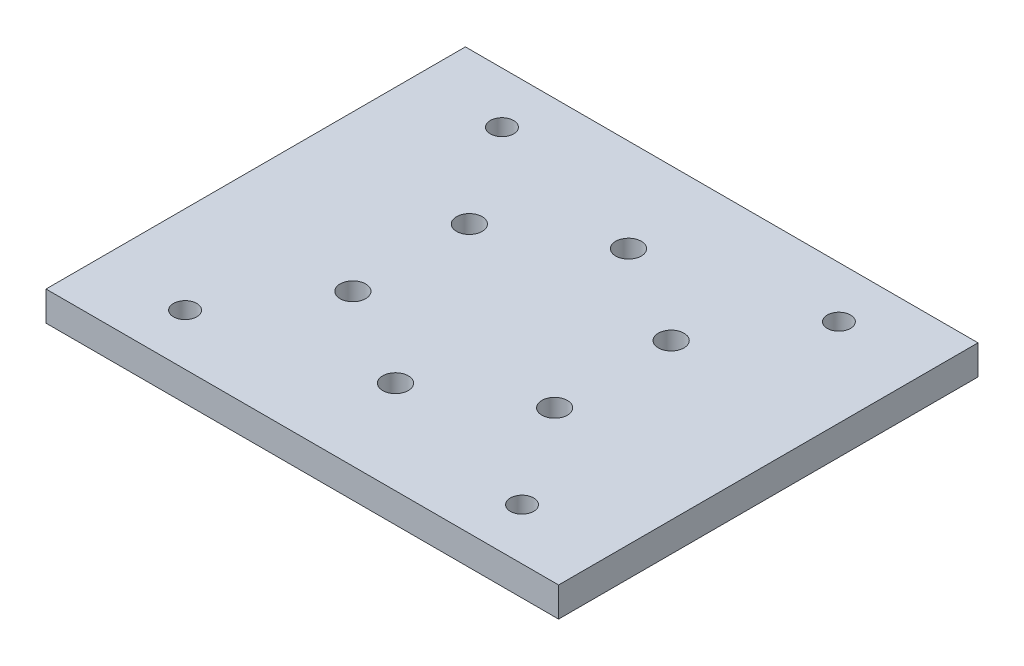
ISO-10303-21;
HEADER;
FILE_DESCRIPTION(('STEP AP214'),'2;1');
FILE_NAME('part.step','',(''),(''),'','','');
FILE_SCHEMA(('AUTOMOTIVE_DESIGN { 1 0 10303 214 1 1 1 1 }'));
ENDSEC;
DATA;
#1=APPLICATION_CONTEXT('core data for automotive mechanical design processes');
#2=APPLICATION_PROTOCOL_DEFINITION('international standard','automotive_design',2000,#1);
#3=PRODUCT_CONTEXT('',#1,'mechanical');
#4=PRODUCT('Part','Part','',(#3));
#5=PRODUCT_RELATED_PRODUCT_CATEGORY('part','',(#4));
#6=PRODUCT_DEFINITION_FORMATION('','',#4);
#7=PRODUCT_DEFINITION_CONTEXT('part definition',#1,'design');
#8=PRODUCT_DEFINITION('design','',#6,#7);
#9=PRODUCT_DEFINITION_SHAPE('','',#8);
#10=(LENGTH_UNIT() NAMED_UNIT(*) SI_UNIT(.MILLI.,.METRE.));
#11=(NAMED_UNIT(*) PLANE_ANGLE_UNIT() SI_UNIT($,.RADIAN.));
#12=(NAMED_UNIT(*) SI_UNIT($,.STERADIAN.) SOLID_ANGLE_UNIT());
#13=UNCERTAINTY_MEASURE_WITH_UNIT(LENGTH_MEASURE(1.E-05),#10,'distance_accuracy_value','');
#14=(GEOMETRIC_REPRESENTATION_CONTEXT(3) GLOBAL_UNCERTAINTY_ASSIGNED_CONTEXT((#13)) GLOBAL_UNIT_ASSIGNED_CONTEXT((#10,
#11,#12)) REPRESENTATION_CONTEXT('',''));
#15=CARTESIAN_POINT('',(0.,0.,0.));
#16=DIRECTION('',(0.,0.,1.));
#17=DIRECTION('',(1.,0.,0.));
#18=AXIS2_PLACEMENT_3D('',#15,#16,#17);
#19=CARTESIAN_POINT('',(110.,6.35,0.));
#20=DIRECTION('',(0.,0.,-1.));
#21=DIRECTION('',(-1.,0.,0.));
#22=AXIS2_PLACEMENT_3D('',#19,#20,#21);
#23=PLANE('',#22);
#24=DIRECTION('',(1.,0.,0.));
#25=VECTOR('',#24,1.);
#26=CARTESIAN_POINT('',(110.,0.,0.));
#27=LINE('',#26,#25);
#28=CARTESIAN_POINT('',(0.,0.,0.));
#29=VERTEX_POINT('',#28);
#30=CARTESIAN_POINT('',(110.,0.,0.));
#31=VERTEX_POINT('',#30);
#32=EDGE_CURVE('E102',#29,#31,#27,.T.);
#33=ORIENTED_EDGE('',*,*,#32,.T.);
#34=DIRECTION('',(0.,-1.,0.));
#35=VECTOR('',#34,1.);
#36=CARTESIAN_POINT('',(110.,6.35,0.));
#37=LINE('',#36,#35);
#38=CARTESIAN_POINT('',(110.,6.35,0.));
#39=VERTEX_POINT('',#38);
#40=EDGE_CURVE('E11',#39,#31,#37,.T.);
#41=ORIENTED_EDGE('',*,*,#40,.F.);
#42=DIRECTION('',(1.,0.,0.));
#43=VECTOR('',#42,1.);
#44=CARTESIAN_POINT('',(110.,6.35,0.));
#45=LINE('',#44,#43);
#46=CARTESIAN_POINT('',(0.,6.35,0.));
#47=VERTEX_POINT('',#46);
#48=EDGE_CURVE('E90',#47,#39,#45,.T.);
#49=ORIENTED_EDGE('',*,*,#48,.F.);
#50=DIRECTION('',(0.,-1.,0.));
#51=VECTOR('',#50,1.);
#52=CARTESIAN_POINT('',(0.,6.35,0.));
#53=LINE('',#52,#51);
#54=EDGE_CURVE('E98',#47,#29,#53,.T.);
#55=ORIENTED_EDGE('',*,*,#54,.T.);
#56=EDGE_LOOP('',(#33,#41,#49,#55));
#57=FACE_BOUND('',#56,.T.);
#58=ADVANCED_FACE('F39',(#57),#23,.F.);
#59=CARTESIAN_POINT('',(110.,6.35,-90.));
#60=DIRECTION('',(-1.,0.,0.));
#61=DIRECTION('',(0.,0.,1.));
#62=AXIS2_PLACEMENT_3D('',#59,#60,#61);
#63=PLANE('',#62);
#64=DIRECTION('',(0.,0.,-1.));
#65=VECTOR('',#64,1.);
#66=CARTESIAN_POINT('',(110.,0.,-90.));
#67=LINE('',#66,#65);
#68=CARTESIAN_POINT('',(110.,0.,-90.));
#69=VERTEX_POINT('',#68);
#70=EDGE_CURVE('E94',#31,#69,#67,.T.);
#71=ORIENTED_EDGE('',*,*,#70,.T.);
#72=DIRECTION('',(0.,-1.,0.));
#73=VECTOR('',#72,1.);
#74=CARTESIAN_POINT('',(110.,6.35,-90.));
#75=LINE('',#74,#73);
#76=CARTESIAN_POINT('',(110.,6.35,-90.));
#77=VERTEX_POINT('',#76);
#78=EDGE_CURVE('E47',#77,#69,#75,.T.);
#79=ORIENTED_EDGE('',*,*,#78,.F.);
#80=DIRECTION('',(0.,0.,-1.));
#81=VECTOR('',#80,1.);
#82=CARTESIAN_POINT('',(110.,6.35,-90.));
#83=LINE('',#82,#81);
#84=EDGE_CURVE('E85',#39,#77,#83,.T.);
#85=ORIENTED_EDGE('',*,*,#84,.F.);
#86=ORIENTED_EDGE('',*,*,#40,.T.);
#87=EDGE_LOOP('',(#71,#79,#85,#86));
#88=FACE_BOUND('',#87,.T.);
#89=ADVANCED_FACE('F93',(#88),#63,.F.);
#90=CARTESIAN_POINT('',(0.,6.35,-90.));
#91=DIRECTION('',(0.,0.,1.));
#92=DIRECTION('',(1.,0.,0.));
#93=AXIS2_PLACEMENT_3D('',#90,#91,#92);
#94=PLANE('',#93);
#95=DIRECTION('',(-1.,0.,0.));
#96=VECTOR('',#95,1.);
#97=CARTESIAN_POINT('',(0.,0.,-90.));
#98=LINE('',#97,#96);
#99=CARTESIAN_POINT('',(0.,0.,-90.));
#100=VERTEX_POINT('',#99);
#101=EDGE_CURVE('E72',#69,#100,#98,.T.);
#102=ORIENTED_EDGE('',*,*,#101,.T.);
#103=DIRECTION('',(0.,-1.,0.));
#104=VECTOR('',#103,1.);
#105=CARTESIAN_POINT('',(0.,6.35,-90.));
#106=LINE('',#105,#104);
#107=CARTESIAN_POINT('',(0.,6.35,-90.));
#108=VERTEX_POINT('',#107);
#109=EDGE_CURVE('E95',#108,#100,#106,.T.);
#110=ORIENTED_EDGE('',*,*,#109,.F.);
#111=DIRECTION('',(-1.,0.,0.));
#112=VECTOR('',#111,1.);
#113=CARTESIAN_POINT('',(0.,6.35,-90.));
#114=LINE('',#113,#112);
#115=EDGE_CURVE('E88',#77,#108,#114,.T.);
#116=ORIENTED_EDGE('',*,*,#115,.F.);
#117=ORIENTED_EDGE('',*,*,#78,.T.);
#118=EDGE_LOOP('',(#102,#110,#116,#117));
#119=FACE_BOUND('',#118,.T.);
#120=ADVANCED_FACE('F96',(#119),#94,.F.);
#121=CARTESIAN_POINT('',(0.,6.35,0.));
#122=DIRECTION('',(1.,0.,0.));
#123=DIRECTION('',(0.,0.,-1.));
#124=AXIS2_PLACEMENT_3D('',#121,#122,#123);
#125=PLANE('',#124);
#126=DIRECTION('',(0.,0.,1.));
#127=VECTOR('',#126,1.);
#128=CARTESIAN_POINT('',(0.,0.,0.));
#129=LINE('',#128,#127);
#130=EDGE_CURVE('E78',#100,#29,#129,.T.);
#131=ORIENTED_EDGE('',*,*,#130,.T.);
#132=ORIENTED_EDGE('',*,*,#54,.F.);
#133=DIRECTION('',(0.,0.,1.));
#134=VECTOR('',#133,1.);
#135=CARTESIAN_POINT('',(0.,6.35,0.));
#136=LINE('',#135,#134);
#137=EDGE_CURVE('E55',#108,#47,#136,.T.);
#138=ORIENTED_EDGE('',*,*,#137,.F.);
#139=ORIENTED_EDGE('',*,*,#109,.T.);
#140=EDGE_LOOP('',(#131,#132,#138,#139));
#141=FACE_BOUND('',#140,.T.);
#142=ADVANCED_FACE('F110',(#141),#125,.F.);
#143=CARTESIAN_POINT('',(0.,6.35,0.));
#144=DIRECTION('',(0.,-1.,0.));
#145=DIRECTION('',(0.,0.,-1.));
#146=AXIS2_PLACEMENT_3D('',#143,#144,#145);
#147=PLANE('',#146);
#148=CARTESIAN_POINT('',(55.,6.35,-70.));
#149=DIRECTION('',(0.,1.,0.));
#150=DIRECTION('',(0.,0.,1.));
#151=AXIS2_PLACEMENT_3D('',#148,#149,#150);
#152=CIRCLE('',#151,2.75);
#153=CARTESIAN_POINT('',(55.,6.35,-67.25));
#154=VERTEX_POINT('',#153);
#155=EDGE_CURVE('E165',#154,#154,#152,.T.);
#156=ORIENTED_EDGE('',*,*,#155,.F.);
#157=EDGE_LOOP('',(#156));
#158=FACE_BOUND('',#157,.T.);
#159=CARTESIAN_POINT('',(33.3493649053895,6.35,-57.4999999999997));
#160=DIRECTION('',(0.,1.,0.));
#161=DIRECTION('',(0.,0.,1.));
#162=AXIS2_PLACEMENT_3D('',#159,#160,#161);
#163=CIRCLE('',#162,2.75);
#164=CARTESIAN_POINT('',(33.3493649053895,6.35,-54.7499999999997));
#165=VERTEX_POINT('',#164);
#166=EDGE_CURVE('E144',#165,#165,#163,.T.);
#167=ORIENTED_EDGE('',*,*,#166,.F.);
#168=EDGE_LOOP('',(#167));
#169=FACE_BOUND('',#168,.T.);
#170=CARTESIAN_POINT('',(33.349364905389,6.35,-32.5));
#171=DIRECTION('',(0.,1.,0.));
#172=DIRECTION('',(0.,0.,1.));
#173=AXIS2_PLACEMENT_3D('',#170,#171,#172);
#174=CIRCLE('',#173,2.75);
#175=CARTESIAN_POINT('',(33.349364905389,6.35,-29.75));
#176=VERTEX_POINT('',#175);
#177=EDGE_CURVE('E143',#176,#176,#174,.T.);
#178=ORIENTED_EDGE('',*,*,#177,.F.);
#179=EDGE_LOOP('',(#178));
#180=FACE_BOUND('',#179,.T.);
#181=CARTESIAN_POINT('',(55.,6.35,-19.9999999999999));
#182=DIRECTION('',(0.,1.,0.));
#183=DIRECTION('',(0.,0.,1.));
#184=AXIS2_PLACEMENT_3D('',#181,#182,#183);
#185=CIRCLE('',#184,2.75);
#186=CARTESIAN_POINT('',(55.,6.35,-17.2499999999999));
#187=VERTEX_POINT('',#186);
#188=EDGE_CURVE('E150',#187,#187,#185,.T.);
#189=ORIENTED_EDGE('',*,*,#188,.F.);
#190=EDGE_LOOP('',(#189));
#191=FACE_BOUND('',#190,.T.);
#192=CARTESIAN_POINT('',(76.650635094611,6.35,-32.4999999999999));
#193=DIRECTION('',(0.,1.,0.));
#194=DIRECTION('',(0.,0.,1.));
#195=AXIS2_PLACEMENT_3D('',#192,#193,#194);
#196=CIRCLE('',#195,2.75000000000001);
#197=CARTESIAN_POINT('',(76.650635094611,6.35,-29.7499999999999));
#198=VERTEX_POINT('',#197);
#199=EDGE_CURVE('E156',#198,#198,#196,.T.);
#200=ORIENTED_EDGE('',*,*,#199,.F.);
#201=EDGE_LOOP('',(#200));
#202=FACE_BOUND('',#201,.T.);
#203=CARTESIAN_POINT('',(76.6506350946114,6.35,-57.5000000000006));
#204=DIRECTION('',(0.,1.,0.));
#205=DIRECTION('',(0.,0.,1.));
#206=AXIS2_PLACEMENT_3D('',#203,#204,#205);
#207=CIRCLE('',#206,2.75000000000001);
#208=CARTESIAN_POINT('',(76.6506350946114,6.35,-54.7500000000006));
#209=VERTEX_POINT('',#208);
#210=EDGE_CURVE('E162',#209,#209,#207,.T.);
#211=ORIENTED_EDGE('',*,*,#210,.F.);
#212=EDGE_LOOP('',(#211));
#213=FACE_BOUND('',#212,.T.);
#214=CARTESIAN_POINT('',(91.1499999999999,6.35,-79.));
#215=DIRECTION('',(0.,1.,0.));
#216=DIRECTION('',(0.,0.,-1.));
#217=AXIS2_PLACEMENT_3D('',#214,#215,#216);
#218=CIRCLE('',#217,2.5);
#219=CARTESIAN_POINT('',(91.1499999999999,6.35,-81.5));
#220=VERTEX_POINT('',#219);
#221=EDGE_CURVE('E125',#220,#220,#218,.T.);
#222=ORIENTED_EDGE('',*,*,#221,.F.);
#223=EDGE_LOOP('',(#222));
#224=FACE_BOUND('',#223,.T.);
#225=CARTESIAN_POINT('',(91.15,6.35,-11.));
#226=DIRECTION('',(0.,1.,0.));
#227=DIRECTION('',(0.,0.,1.));
#228=AXIS2_PLACEMENT_3D('',#225,#226,#227);
#229=CIRCLE('',#228,2.50000000000001);
#230=CARTESIAN_POINT('',(91.15,6.35,-8.50000000000001));
#231=VERTEX_POINT('',#230);
#232=EDGE_CURVE('E132',#231,#231,#229,.T.);
#233=ORIENTED_EDGE('',*,*,#232,.F.);
#234=EDGE_LOOP('',(#233));
#235=FACE_BOUND('',#234,.T.);
#236=CARTESIAN_POINT('',(18.85,6.35,-11.));
#237=DIRECTION('',(0.,1.,0.));
#238=DIRECTION('',(0.,0.,-1.));
#239=AXIS2_PLACEMENT_3D('',#236,#237,#238);
#240=CIRCLE('',#239,2.5);
#241=CARTESIAN_POINT('',(18.85,6.35,-13.5));
#242=VERTEX_POINT('',#241);
#243=EDGE_CURVE('E119',#242,#242,#240,.T.);
#244=ORIENTED_EDGE('',*,*,#243,.F.);
#245=EDGE_LOOP('',(#244));
#246=FACE_BOUND('',#245,.T.);
#247=CARTESIAN_POINT('',(18.85,6.35,-79.));
#248=DIRECTION('',(0.,1.,0.));
#249=DIRECTION('',(0.,0.,1.));
#250=AXIS2_PLACEMENT_3D('',#247,#248,#249);
#251=CIRCLE('',#250,2.5);
#252=CARTESIAN_POINT('',(18.85,6.35,-76.5));
#253=VERTEX_POINT('',#252);
#254=EDGE_CURVE('E116',#253,#253,#251,.T.);
#255=ORIENTED_EDGE('',*,*,#254,.F.);
#256=EDGE_LOOP('',(#255));
#257=FACE_BOUND('',#256,.T.);
#258=ORIENTED_EDGE('',*,*,#48,.T.);
#259=ORIENTED_EDGE('',*,*,#84,.T.);
#260=ORIENTED_EDGE('',*,*,#115,.T.);
#261=ORIENTED_EDGE('',*,*,#137,.T.);
#262=EDGE_LOOP('',(#258,#259,#260,#261));
#263=FACE_BOUND('',#262,.T.);
#264=ADVANCED_FACE('F86',(#158,#169,#180,#191,#202,#213,#224,#235,#246,#257,#263),#147,.F.);
#265=CARTESIAN_POINT('',(0.,0.,0.));
#266=DIRECTION('',(0.,-1.,0.));
#267=DIRECTION('',(0.,0.,-1.));
#268=AXIS2_PLACEMENT_3D('',#265,#266,#267);
#269=PLANE('',#268);
#270=CARTESIAN_POINT('',(55.,0.,-70.));
#271=DIRECTION('',(0.,1.,0.));
#272=DIRECTION('',(0.,0.,1.));
#273=AXIS2_PLACEMENT_3D('',#270,#271,#272);
#274=CIRCLE('',#273,2.75);
#275=CARTESIAN_POINT('',(55.,0.,-67.25));
#276=VERTEX_POINT('',#275);
#277=EDGE_CURVE('E126',#276,#276,#274,.T.);
#278=ORIENTED_EDGE('',*,*,#277,.T.);
#279=EDGE_LOOP('',(#278));
#280=FACE_BOUND('',#279,.T.);
#281=CARTESIAN_POINT('',(33.3493649053895,0.,-57.4999999999997));
#282=DIRECTION('',(0.,1.,0.));
#283=DIRECTION('',(0.,0.,1.));
#284=AXIS2_PLACEMENT_3D('',#281,#282,#283);
#285=CIRCLE('',#284,2.75);
#286=CARTESIAN_POINT('',(33.3493649053895,0.,-54.7499999999997));
#287=VERTEX_POINT('',#286);
#288=EDGE_CURVE('E166',#287,#287,#285,.T.);
#289=ORIENTED_EDGE('',*,*,#288,.T.);
#290=EDGE_LOOP('',(#289));
#291=FACE_BOUND('',#290,.T.);
#292=CARTESIAN_POINT('',(33.349364905389,0.,-32.5));
#293=DIRECTION('',(0.,1.,0.));
#294=DIRECTION('',(0.,0.,1.));
#295=AXIS2_PLACEMENT_3D('',#292,#293,#294);
#296=CIRCLE('',#295,2.75);
#297=CARTESIAN_POINT('',(33.349364905389,0.,-29.75));
#298=VERTEX_POINT('',#297);
#299=EDGE_CURVE('E140',#298,#298,#296,.T.);
#300=ORIENTED_EDGE('',*,*,#299,.T.);
#301=EDGE_LOOP('',(#300));
#302=FACE_BOUND('',#301,.T.);
#303=CARTESIAN_POINT('',(55.,0.,-19.9999999999999));
#304=DIRECTION('',(0.,1.,0.));
#305=DIRECTION('',(0.,0.,1.));
#306=AXIS2_PLACEMENT_3D('',#303,#304,#305);
#307=CIRCLE('',#306,2.75);
#308=CARTESIAN_POINT('',(55.,0.,-17.2499999999999));
#309=VERTEX_POINT('',#308);
#310=EDGE_CURVE('E147',#309,#309,#307,.T.);
#311=ORIENTED_EDGE('',*,*,#310,.T.);
#312=EDGE_LOOP('',(#311));
#313=FACE_BOUND('',#312,.T.);
#314=CARTESIAN_POINT('',(76.650635094611,0.,-32.4999999999999));
#315=DIRECTION('',(0.,1.,0.));
#316=DIRECTION('',(0.,0.,1.));
#317=AXIS2_PLACEMENT_3D('',#314,#315,#316);
#318=CIRCLE('',#317,2.75000000000001);
#319=CARTESIAN_POINT('',(76.650635094611,0.,-29.7499999999999));
#320=VERTEX_POINT('',#319);
#321=EDGE_CURVE('E153',#320,#320,#318,.T.);
#322=ORIENTED_EDGE('',*,*,#321,.T.);
#323=EDGE_LOOP('',(#322));
#324=FACE_BOUND('',#323,.T.);
#325=CARTESIAN_POINT('',(76.6506350946114,0.,-57.5000000000006));
#326=DIRECTION('',(0.,1.,0.));
#327=DIRECTION('',(0.,0.,1.));
#328=AXIS2_PLACEMENT_3D('',#325,#326,#327);
#329=CIRCLE('',#328,2.75000000000001);
#330=CARTESIAN_POINT('',(76.6506350946114,0.,-54.7500000000006));
#331=VERTEX_POINT('',#330);
#332=EDGE_CURVE('E159',#331,#331,#329,.T.);
#333=ORIENTED_EDGE('',*,*,#332,.T.);
#334=EDGE_LOOP('',(#333));
#335=FACE_BOUND('',#334,.T.);
#336=CARTESIAN_POINT('',(91.1499999999999,0.,-79.));
#337=DIRECTION('',(0.,1.,0.));
#338=DIRECTION('',(0.,0.,-1.));
#339=AXIS2_PLACEMENT_3D('',#336,#337,#338);
#340=CIRCLE('',#339,2.5);
#341=CARTESIAN_POINT('',(91.1499999999999,0.,-81.5));
#342=VERTEX_POINT('',#341);
#343=EDGE_CURVE('E122',#342,#342,#340,.T.);
#344=ORIENTED_EDGE('',*,*,#343,.T.);
#345=EDGE_LOOP('',(#344));
#346=FACE_BOUND('',#345,.T.);
#347=CARTESIAN_POINT('',(91.15,0.,-11.));
#348=DIRECTION('',(0.,1.,0.));
#349=DIRECTION('',(0.,0.,1.));
#350=AXIS2_PLACEMENT_3D('',#347,#348,#349);
#351=CIRCLE('',#350,2.50000000000001);
#352=CARTESIAN_POINT('',(91.15,0.,-8.50000000000001));
#353=VERTEX_POINT('',#352);
#354=EDGE_CURVE('E129',#353,#353,#351,.T.);
#355=ORIENTED_EDGE('',*,*,#354,.T.);
#356=EDGE_LOOP('',(#355));
#357=FACE_BOUND('',#356,.T.);
#358=CARTESIAN_POINT('',(18.85,0.,-11.));
#359=DIRECTION('',(0.,1.,0.));
#360=DIRECTION('',(0.,0.,-1.));
#361=AXIS2_PLACEMENT_3D('',#358,#359,#360);
#362=CIRCLE('',#361,2.5);
#363=CARTESIAN_POINT('',(18.85,0.,-13.5));
#364=VERTEX_POINT('',#363);
#365=EDGE_CURVE('E135',#364,#364,#362,.T.);
#366=ORIENTED_EDGE('',*,*,#365,.T.);
#367=EDGE_LOOP('',(#366));
#368=FACE_BOUND('',#367,.T.);
#369=CARTESIAN_POINT('',(18.85,0.,-79.));
#370=DIRECTION('',(0.,1.,0.));
#371=DIRECTION('',(0.,0.,1.));
#372=AXIS2_PLACEMENT_3D('',#369,#370,#371);
#373=CIRCLE('',#372,2.5);
#374=CARTESIAN_POINT('',(18.85,0.,-76.5));
#375=VERTEX_POINT('',#374);
#376=EDGE_CURVE('E105',#375,#375,#373,.T.);
#377=ORIENTED_EDGE('',*,*,#376,.T.);
#378=EDGE_LOOP('',(#377));
#379=FACE_BOUND('',#378,.T.);
#380=ORIENTED_EDGE('',*,*,#32,.F.);
#381=ORIENTED_EDGE('',*,*,#130,.F.);
#382=ORIENTED_EDGE('',*,*,#101,.F.);
#383=ORIENTED_EDGE('',*,*,#70,.F.);
#384=EDGE_LOOP('',(#380,#381,#382,#383));
#385=FACE_BOUND('',#384,.T.);
#386=ADVANCED_FACE('F113',(#280,#291,#302,#313,#324,#335,#346,#357,#368,#379,#385),#269,.T.);
#387=CARTESIAN_POINT('',(18.85,0.,-79.));
#388=DIRECTION('',(0.,1.,0.));
#389=DIRECTION('',(0.,0.,1.));
#390=AXIS2_PLACEMENT_3D('',#387,#388,#389);
#391=CYLINDRICAL_SURFACE('',#390,2.5);
#392=ORIENTED_EDGE('',*,*,#376,.F.);
#393=EDGE_LOOP('',(#392));
#394=FACE_BOUND('',#393,.T.);
#395=ORIENTED_EDGE('',*,*,#254,.T.);
#396=EDGE_LOOP('',(#395));
#397=FACE_BOUND('',#396,.T.);
#398=ADVANCED_FACE('F206',(#394,#397),#391,.F.);
#399=CARTESIAN_POINT('',(18.85,0.,-11.));
#400=DIRECTION('',(0.,1.,0.));
#401=DIRECTION('',(0.,0.,1.));
#402=AXIS2_PLACEMENT_3D('',#399,#400,#401);
#403=CYLINDRICAL_SURFACE('',#402,2.5);
#404=ORIENTED_EDGE('',*,*,#365,.F.);
#405=EDGE_LOOP('',(#404));
#406=FACE_BOUND('',#405,.T.);
#407=ORIENTED_EDGE('',*,*,#243,.T.);
#408=EDGE_LOOP('',(#407));
#409=FACE_BOUND('',#408,.T.);
#410=ADVANCED_FACE('F208',(#406,#409),#403,.F.);
#411=CARTESIAN_POINT('',(91.15,0.,-11.));
#412=DIRECTION('',(0.,1.,0.));
#413=DIRECTION('',(0.,0.,1.));
#414=AXIS2_PLACEMENT_3D('',#411,#412,#413);
#415=CYLINDRICAL_SURFACE('',#414,2.50000000000001);
#416=ORIENTED_EDGE('',*,*,#354,.F.);
#417=EDGE_LOOP('',(#416));
#418=FACE_BOUND('',#417,.T.);
#419=ORIENTED_EDGE('',*,*,#232,.T.);
#420=EDGE_LOOP('',(#419));
#421=FACE_BOUND('',#420,.T.);
#422=ADVANCED_FACE('F215',(#418,#421),#415,.F.);
#423=CARTESIAN_POINT('',(91.1499999999999,0.,-79.));
#424=DIRECTION('',(0.,1.,0.));
#425=DIRECTION('',(0.,0.,1.));
#426=AXIS2_PLACEMENT_3D('',#423,#424,#425);
#427=CYLINDRICAL_SURFACE('',#426,2.5);
#428=ORIENTED_EDGE('',*,*,#343,.F.);
#429=EDGE_LOOP('',(#428));
#430=FACE_BOUND('',#429,.T.);
#431=ORIENTED_EDGE('',*,*,#221,.T.);
#432=EDGE_LOOP('',(#431));
#433=FACE_BOUND('',#432,.T.);
#434=ADVANCED_FACE('F275',(#430,#433),#427,.F.);
#435=CARTESIAN_POINT('',(76.6506350946114,0.,-57.5000000000006));
#436=DIRECTION('',(0.,1.,0.));
#437=DIRECTION('',(0.,0.,1.));
#438=AXIS2_PLACEMENT_3D('',#435,#436,#437);
#439=CYLINDRICAL_SURFACE('',#438,2.75000000000001);
#440=ORIENTED_EDGE('',*,*,#332,.F.);
#441=EDGE_LOOP('',(#440));
#442=FACE_BOUND('',#441,.T.);
#443=ORIENTED_EDGE('',*,*,#210,.T.);
#444=EDGE_LOOP('',(#443));
#445=FACE_BOUND('',#444,.T.);
#446=ADVANCED_FACE('F284',(#442,#445),#439,.F.);
#447=CARTESIAN_POINT('',(76.650635094611,0.,-32.4999999999999));
#448=DIRECTION('',(0.,1.,0.));
#449=DIRECTION('',(0.,0.,1.));
#450=AXIS2_PLACEMENT_3D('',#447,#448,#449);
#451=CYLINDRICAL_SURFACE('',#450,2.75000000000001);
#452=ORIENTED_EDGE('',*,*,#321,.F.);
#453=EDGE_LOOP('',(#452));
#454=FACE_BOUND('',#453,.T.);
#455=ORIENTED_EDGE('',*,*,#199,.T.);
#456=EDGE_LOOP('',(#455));
#457=FACE_BOUND('',#456,.T.);
#458=ADVANCED_FACE('F292',(#454,#457),#451,.F.);
#459=CARTESIAN_POINT('',(55.,0.,-19.9999999999999));
#460=DIRECTION('',(0.,1.,0.));
#461=DIRECTION('',(0.,0.,1.));
#462=AXIS2_PLACEMENT_3D('',#459,#460,#461);
#463=CYLINDRICAL_SURFACE('',#462,2.75);
#464=ORIENTED_EDGE('',*,*,#310,.F.);
#465=EDGE_LOOP('',(#464));
#466=FACE_BOUND('',#465,.T.);
#467=ORIENTED_EDGE('',*,*,#188,.T.);
#468=EDGE_LOOP('',(#467));
#469=FACE_BOUND('',#468,.T.);
#470=ADVANCED_FACE('F301',(#466,#469),#463,.F.);
#471=CARTESIAN_POINT('',(33.349364905389,0.,-32.5));
#472=DIRECTION('',(0.,1.,0.));
#473=DIRECTION('',(0.,0.,1.));
#474=AXIS2_PLACEMENT_3D('',#471,#472,#473);
#475=CYLINDRICAL_SURFACE('',#474,2.75);
#476=ORIENTED_EDGE('',*,*,#299,.F.);
#477=EDGE_LOOP('',(#476));
#478=FACE_BOUND('',#477,.T.);
#479=ORIENTED_EDGE('',*,*,#177,.T.);
#480=EDGE_LOOP('',(#479));
#481=FACE_BOUND('',#480,.T.);
#482=ADVANCED_FACE('F310',(#478,#481),#475,.F.);
#483=CARTESIAN_POINT('',(33.3493649053895,0.,-57.4999999999997));
#484=DIRECTION('',(0.,1.,0.));
#485=DIRECTION('',(0.,0.,1.));
#486=AXIS2_PLACEMENT_3D('',#483,#484,#485);
#487=CYLINDRICAL_SURFACE('',#486,2.75);
#488=ORIENTED_EDGE('',*,*,#288,.F.);
#489=EDGE_LOOP('',(#488));
#490=FACE_BOUND('',#489,.T.);
#491=ORIENTED_EDGE('',*,*,#166,.T.);
#492=EDGE_LOOP('',(#491));
#493=FACE_BOUND('',#492,.T.);
#494=ADVANCED_FACE('F181',(#490,#493),#487,.F.);
#495=CARTESIAN_POINT('',(55.,0.,-70.));
#496=DIRECTION('',(0.,1.,0.));
#497=DIRECTION('',(0.,0.,1.));
#498=AXIS2_PLACEMENT_3D('',#495,#496,#497);
#499=CYLINDRICAL_SURFACE('',#498,2.75);
#500=ORIENTED_EDGE('',*,*,#277,.F.);
#501=EDGE_LOOP('',(#500));
#502=FACE_BOUND('',#501,.T.);
#503=ORIENTED_EDGE('',*,*,#155,.T.);
#504=EDGE_LOOP('',(#503));
#505=FACE_BOUND('',#504,.T.);
#506=ADVANCED_FACE('F178',(#502,#505),#499,.F.);
#507=CLOSED_SHELL('',(#58,#89,#120,#142,#264,#386,#398,#410,#422,#434,#446,#458,#470,#482,#494,#506));
#508=MANIFOLD_SOLID_BREP('B2',#507);
#509=ADVANCED_BREP_SHAPE_REPRESENTATION('',(#18,#508),#14);
#510=SHAPE_DEFINITION_REPRESENTATION(#9,#509);
ENDSEC;
END-ISO-10303-21;
